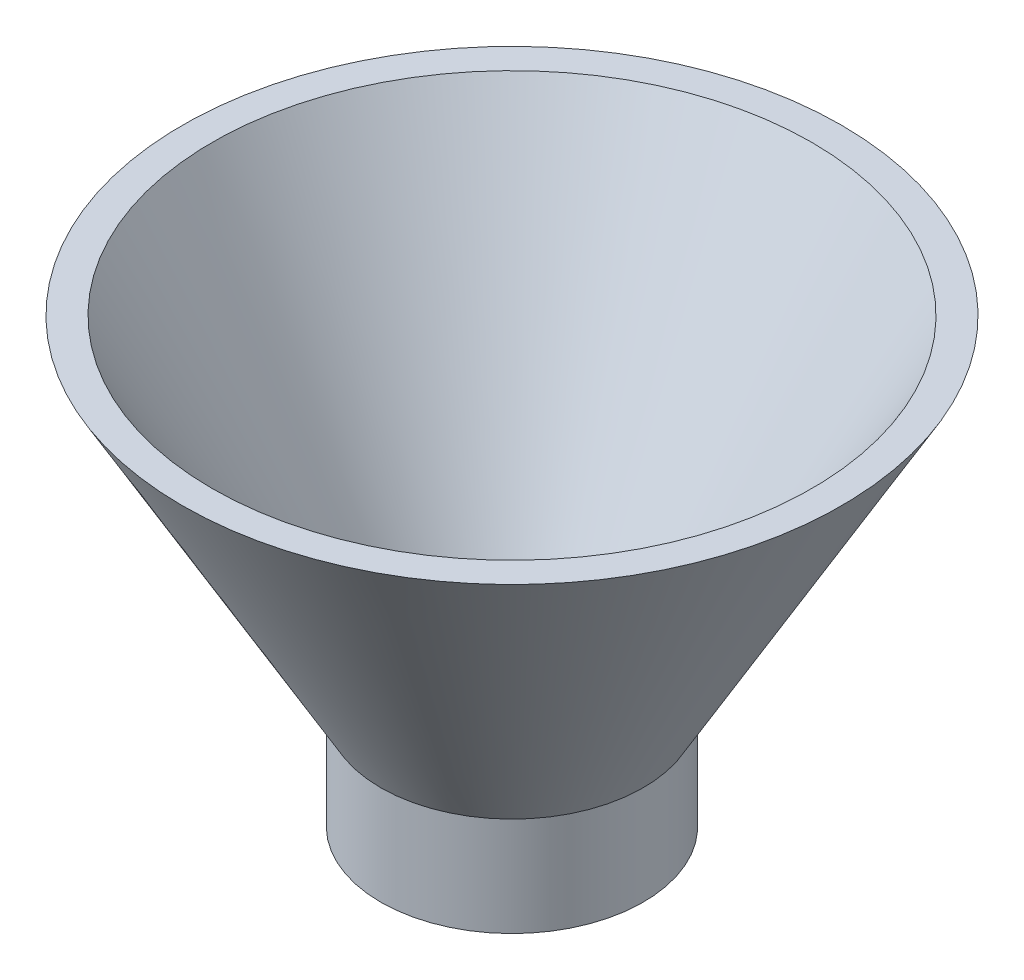
ISO-10303-21;
HEADER;
FILE_DESCRIPTION(('STEP AP214'),'2;1');
FILE_NAME('part.step','',(''),(''),'','','');
FILE_SCHEMA(('AUTOMOTIVE_DESIGN { 1 0 10303 214 1 1 1 1 }'));
ENDSEC;
DATA;
#1=APPLICATION_CONTEXT('core data for automotive mechanical design processes');
#2=APPLICATION_PROTOCOL_DEFINITION('international standard','automotive_design',2000,#1);
#3=PRODUCT_CONTEXT('',#1,'mechanical');
#4=PRODUCT('Part','Part','',(#3));
#5=PRODUCT_RELATED_PRODUCT_CATEGORY('part','',(#4));
#6=PRODUCT_DEFINITION_FORMATION('','',#4);
#7=PRODUCT_DEFINITION_CONTEXT('part definition',#1,'design');
#8=PRODUCT_DEFINITION('design','',#6,#7);
#9=PRODUCT_DEFINITION_SHAPE('','',#8);
#10=(LENGTH_UNIT() NAMED_UNIT(*) SI_UNIT(.MILLI.,.METRE.));
#11=(NAMED_UNIT(*) PLANE_ANGLE_UNIT() SI_UNIT($,.RADIAN.));
#12=(NAMED_UNIT(*) SI_UNIT($,.STERADIAN.) SOLID_ANGLE_UNIT());
#13=UNCERTAINTY_MEASURE_WITH_UNIT(LENGTH_MEASURE(1.E-05),#10,'distance_accuracy_value','');
#14=(GEOMETRIC_REPRESENTATION_CONTEXT(3) GLOBAL_UNCERTAINTY_ASSIGNED_CONTEXT((#13)) GLOBAL_UNIT_ASSIGNED_CONTEXT((#10,
#11,#12)) REPRESENTATION_CONTEXT('',''));
#15=CARTESIAN_POINT('',(0.,0.,0.));
#16=DIRECTION('',(0.,0.,1.));
#17=DIRECTION('',(1.,0.,0.));
#18=AXIS2_PLACEMENT_3D('',#15,#16,#17);
#19=CARTESIAN_POINT('',(0.,0.,0.));
#20=DIRECTION('',(0.,1.,0.));
#21=DIRECTION('',(0.,0.,1.));
#22=AXIS2_PLACEMENT_3D('',#19,#20,#21);
#23=PLANE('',#22);
#24=CARTESIAN_POINT('',(0.,0.,0.));
#25=DIRECTION('',(0.,1.,0.));
#26=DIRECTION('',(0.,0.,1.));
#27=AXIS2_PLACEMENT_3D('',#24,#25,#26);
#28=CIRCLE('',#27,13.25);
#29=CARTESIAN_POINT('',(0.,0.,13.25));
#30=VERTEX_POINT('',#29);
#31=EDGE_CURVE('E55',#30,#30,#28,.T.);
#32=ORIENTED_EDGE('',*,*,#31,.F.);
#33=EDGE_LOOP('',(#32));
#34=FACE_BOUND('',#33,.T.);
#35=CARTESIAN_POINT('',(0.,0.,0.));
#36=DIRECTION('',(0.,1.,0.));
#37=DIRECTION('',(0.,0.,1.));
#38=AXIS2_PLACEMENT_3D('',#35,#36,#37);
#39=CIRCLE('',#38,10.25);
#40=CARTESIAN_POINT('',(0.,0.,10.25));
#41=VERTEX_POINT('',#40);
#42=EDGE_CURVE('E60',#41,#41,#39,.T.);
#43=ORIENTED_EDGE('',*,*,#42,.T.);
#44=EDGE_LOOP('',(#43));
#45=FACE_BOUND('',#44,.T.);
#46=ADVANCED_FACE('F37',(#34,#45),#23,.F.);
#47=CARTESIAN_POINT('',(0.,10.,0.));
#48=DIRECTION('',(0.,-1.,0.));
#49=DIRECTION('',(0.,0.,-1.));
#50=AXIS2_PLACEMENT_3D('',#47,#48,#49);
#51=CYLINDRICAL_SURFACE('',#50,13.25);
#52=CARTESIAN_POINT('',(0.,10.,0.));
#53=DIRECTION('',(0.,1.,0.));
#54=DIRECTION('',(0.,0.,1.));
#55=AXIS2_PLACEMENT_3D('',#52,#53,#54);
#56=CIRCLE('',#55,13.25);
#57=CARTESIAN_POINT('',(0.,10.,13.25));
#58=VERTEX_POINT('',#57);
#59=EDGE_CURVE('E50',#58,#58,#56,.T.);
#60=ORIENTED_EDGE('',*,*,#59,.F.);
#61=EDGE_LOOP('',(#60));
#62=FACE_BOUND('',#61,.T.);
#63=ORIENTED_EDGE('',*,*,#31,.T.);
#64=EDGE_LOOP('',(#63));
#65=FACE_BOUND('',#64,.T.);
#66=ADVANCED_FACE('F88',(#62,#65),#51,.T.);
#67=CARTESIAN_POINT('',(0.,10.,0.));
#68=DIRECTION('',(0.,-1.,0.));
#69=DIRECTION('',(0.,0.,-1.));
#70=AXIS2_PLACEMENT_3D('',#67,#68,#69);
#71=CYLINDRICAL_SURFACE('',#70,10.25);
#72=CARTESIAN_POINT('',(0.,7.3205080756888,0.));
#73=DIRECTION('',(0.,1.,0.));
#74=DIRECTION('',(0.,0.,1.));
#75=AXIS2_PLACEMENT_3D('',#72,#73,#74);
#76=CIRCLE('',#75,10.25);
#77=CARTESIAN_POINT('',(0.,7.3205080756888,10.25));
#78=VERTEX_POINT('',#77);
#79=EDGE_CURVE('E10',#78,#78,#76,.T.);
#80=ORIENTED_EDGE('',*,*,#79,.T.);
#81=EDGE_LOOP('',(#80));
#82=FACE_BOUND('',#81,.T.);
#83=ORIENTED_EDGE('',*,*,#42,.F.);
#84=EDGE_LOOP('',(#83));
#85=FACE_BOUND('',#84,.T.);
#86=ADVANCED_FACE('F94',(#82,#85),#71,.F.);
#87=CARTESIAN_POINT('',(0.,44.6410161513777,0.));
#88=DIRECTION('',(0.,1.,0.));
#89=DIRECTION('',(0.,0.,1.));
#90=AXIS2_PLACEMENT_3D('',#87,#88,#89);
#91=CONICAL_SURFACE('',#90,33.2499999999998,0.523598775598293);
#92=ORIENTED_EDGE('',*,*,#59,.T.);
#93=EDGE_LOOP('',(#92));
#94=FACE_BOUND('',#93,.T.);
#95=CARTESIAN_POINT('',(0.,44.6410161513777,0.));
#96=DIRECTION('',(0.,-1.,0.));
#97=DIRECTION('',(0.,0.,-1.));
#98=AXIS2_PLACEMENT_3D('',#95,#96,#97);
#99=CIRCLE('',#98,33.2499999999998);
#100=CARTESIAN_POINT('',(0.,44.6410161513777,-33.2499999999998));
#101=VERTEX_POINT('',#100);
#102=EDGE_CURVE('E65',#101,#101,#99,.T.);
#103=ORIENTED_EDGE('',*,*,#102,.T.);
#104=EDGE_LOOP('',(#103));
#105=FACE_BOUND('',#104,.T.);
#106=ADVANCED_FACE('F84',(#94,#105),#91,.T.);
#107=CARTESIAN_POINT('',(-33.2499999999998,44.6410161513777,0.));
#108=DIRECTION('',(0.,-1.,0.));
#109=DIRECTION('',(0.,0.,-1.));
#110=AXIS2_PLACEMENT_3D('',#107,#108,#109);
#111=PLANE('',#110);
#112=ORIENTED_EDGE('',*,*,#102,.F.);
#113=EDGE_LOOP('',(#112));
#114=FACE_BOUND('',#113,.T.);
#115=CARTESIAN_POINT('',(0.,44.6410161513777,0.));
#116=DIRECTION('',(0.,-1.,0.));
#117=DIRECTION('',(0.,0.,-1.));
#118=AXIS2_PLACEMENT_3D('',#115,#116,#117);
#119=CIRCLE('',#118,30.2499999999998);
#120=CARTESIAN_POINT('',(0.,44.6410161513777,-30.2499999999998));
#121=VERTEX_POINT('',#120);
#122=EDGE_CURVE('E69',#121,#121,#119,.T.);
#123=ORIENTED_EDGE('',*,*,#122,.T.);
#124=EDGE_LOOP('',(#123));
#125=FACE_BOUND('',#124,.T.);
#126=ADVANCED_FACE('F74',(#114,#125),#111,.F.);
#127=CARTESIAN_POINT('',(0.,10.,0.));
#128=DIRECTION('',(0.,1.,0.));
#129=DIRECTION('',(0.,0.,1.));
#130=AXIS2_PLACEMENT_3D('',#127,#128,#129);
#131=CONICAL_SURFACE('',#130,10.25,0.523598775598293);
#132=CARTESIAN_POINT('',(0.,12.3205080756888,0.));
#133=DIRECTION('',(0.,1.,0.));
#134=DIRECTION('',(0.,0.,1.));
#135=AXIS2_PLACEMENT_3D('',#132,#133,#134);
#136=CIRCLE('',#135,11.5897459621556);
#137=CARTESIAN_POINT('',(0.,12.3205080756888,11.5897459621556));
#138=VERTEX_POINT('',#137);
#139=EDGE_CURVE('E45',#138,#138,#136,.F.);
#140=ORIENTED_EDGE('',*,*,#139,.T.);
#141=EDGE_LOOP('',(#140));
#142=FACE_BOUND('',#141,.T.);
#143=ORIENTED_EDGE('',*,*,#122,.F.);
#144=EDGE_LOOP('',(#143));
#145=FACE_BOUND('',#144,.T.);
#146=ADVANCED_FACE('F76',(#142,#145),#131,.F.);
#147=CARTESIAN_POINT('',(0.,7.3205080756888,0.));
#148=DIRECTION('',(0.,1.,0.));
#149=DIRECTION('',(0.,0.,1.));
#150=AXIS2_PLACEMENT_3D('',#147,#148,#149);
#151=TOROIDAL_SURFACE('',#150,20.25,10.);
#152=ORIENTED_EDGE('',*,*,#79,.F.);
#153=EDGE_LOOP('',(#152));
#154=FACE_BOUND('',#153,.T.);
#155=ORIENTED_EDGE('',*,*,#139,.F.);
#156=EDGE_LOOP('',(#155));
#157=FACE_BOUND('',#156,.T.);
#158=ADVANCED_FACE('F39',(#154,#157),#151,.T.);
#159=CLOSED_SHELL('',(#46,#66,#86,#106,#126,#146,#158));
#160=MANIFOLD_SOLID_BREP('B2',#159);
#161=ADVANCED_BREP_SHAPE_REPRESENTATION('',(#18,#160),#14);
#162=SHAPE_DEFINITION_REPRESENTATION(#9,#161);
ENDSEC;
END-ISO-10303-21;
